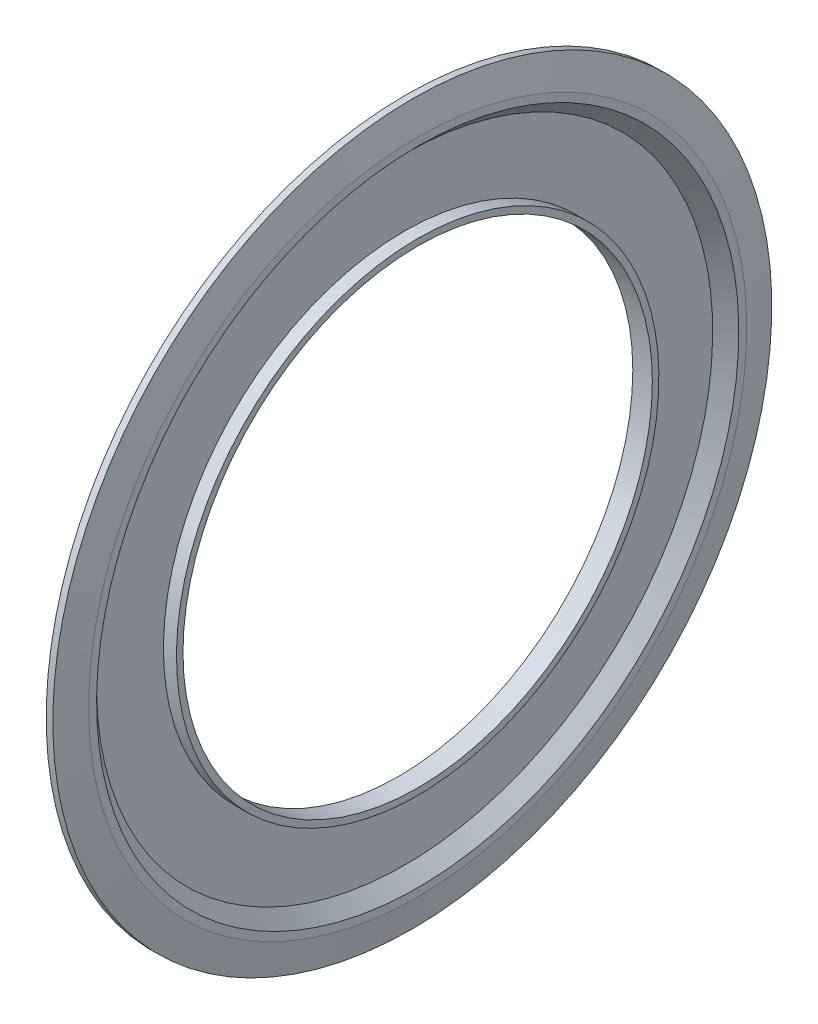
ISO-10303-21;
HEADER;
FILE_DESCRIPTION(('STEP AP214'),'2;1');
FILE_NAME('part.step','',(''),(''),'','','');
FILE_SCHEMA(('AUTOMOTIVE_DESIGN { 1 0 10303 214 1 1 1 1 }'));
ENDSEC;
DATA;
#1=APPLICATION_CONTEXT('core data for automotive mechanical design processes');
#2=APPLICATION_PROTOCOL_DEFINITION('international standard','automotive_design',2000,#1);
#3=PRODUCT_CONTEXT('',#1,'mechanical');
#4=PRODUCT('Part','Part','',(#3));
#5=PRODUCT_RELATED_PRODUCT_CATEGORY('part','',(#4));
#6=PRODUCT_DEFINITION_FORMATION('','',#4);
#7=PRODUCT_DEFINITION_CONTEXT('part definition',#1,'design');
#8=PRODUCT_DEFINITION('design','',#6,#7);
#9=PRODUCT_DEFINITION_SHAPE('','',#8);
#10=(LENGTH_UNIT() NAMED_UNIT(*) SI_UNIT(.MILLI.,.METRE.));
#11=(NAMED_UNIT(*) PLANE_ANGLE_UNIT() SI_UNIT($,.RADIAN.));
#12=(NAMED_UNIT(*) SI_UNIT($,.STERADIAN.) SOLID_ANGLE_UNIT());
#13=UNCERTAINTY_MEASURE_WITH_UNIT(LENGTH_MEASURE(1.E-05),#10,'distance_accuracy_value','');
#14=(GEOMETRIC_REPRESENTATION_CONTEXT(3) GLOBAL_UNCERTAINTY_ASSIGNED_CONTEXT((#13)) GLOBAL_UNIT_ASSIGNED_CONTEXT((#10,
#11,#12)) REPRESENTATION_CONTEXT('',''));
#15=CARTESIAN_POINT('',(0.,0.,0.));
#16=DIRECTION('',(0.,0.,1.));
#17=DIRECTION('',(1.,0.,0.));
#18=AXIS2_PLACEMENT_3D('',#15,#16,#17);
#19=CARTESIAN_POINT('',(0.821553724366853,10.472,0.));
#20=DIRECTION('',(1.,0.,0.));
#21=DIRECTION('',(0.,-1.,0.));
#22=AXIS2_PLACEMENT_3D('',#19,#20,#21);
#23=PLANE('',#22);
#24=CARTESIAN_POINT('',(0.821553724366853,0.,0.));
#25=DIRECTION('',(-1.,0.,0.));
#26=DIRECTION('',(0.,1.,0.));
#27=AXIS2_PLACEMENT_3D('',#24,#25,#26);
#28=CIRCLE('',#27,10.344);
#29=CARTESIAN_POINT('',(0.821553724366853,10.344,0.));
#30=VERTEX_POINT('',#29);
#31=EDGE_CURVE('E11',#30,#30,#28,.T.);
#32=ORIENTED_EDGE('',*,*,#31,.T.);
#33=EDGE_LOOP('',(#32));
#34=FACE_BOUND('',#33,.T.);
#35=CARTESIAN_POINT('',(0.821553724366853,0.,0.));
#36=DIRECTION('',(-1.,0.,0.));
#37=DIRECTION('',(0.,1.,0.));
#38=AXIS2_PLACEMENT_3D('',#35,#36,#37);
#39=CIRCLE('',#38,10.6);
#40=CARTESIAN_POINT('',(0.821553724366853,10.6,0.));
#41=VERTEX_POINT('',#40);
#42=EDGE_CURVE('E56',#41,#41,#39,.T.);
#43=ORIENTED_EDGE('',*,*,#42,.F.);
#44=EDGE_LOOP('',(#43));
#45=FACE_BOUND('',#44,.T.);
#46=ADVANCED_FACE('F16',(#34,#45),#23,.T.);
#47=CARTESIAN_POINT('',(0.611553724366853,0.,0.));
#48=DIRECTION('',(1.,0.,0.));
#49=DIRECTION('',(0.,1.,0.));
#50=AXIS2_PLACEMENT_3D('',#47,#48,#49);
#51=CONICAL_SURFACE('',#50,10.134,0.785398163397448);
#52=CARTESIAN_POINT('',(0.401553724366852,0.,0.));
#53=DIRECTION('',(-1.,0.,0.));
#54=DIRECTION('',(0.,1.,0.));
#55=AXIS2_PLACEMENT_3D('',#52,#53,#54);
#56=CIRCLE('',#55,9.924);
#57=CARTESIAN_POINT('',(0.401553724366852,9.924,0.));
#58=VERTEX_POINT('',#57);
#59=EDGE_CURVE('E26',#58,#58,#56,.T.);
#60=ORIENTED_EDGE('',*,*,#59,.T.);
#61=EDGE_LOOP('',(#60));
#62=FACE_BOUND('',#61,.T.);
#63=ORIENTED_EDGE('',*,*,#31,.F.);
#64=EDGE_LOOP('',(#63));
#65=FACE_BOUND('',#64,.T.);
#66=ADVANCED_FACE('F113',(#62,#65),#51,.F.);
#67=CARTESIAN_POINT('',(0.401553724366851,8.847,0.));
#68=DIRECTION('',(1.,0.,0.));
#69=DIRECTION('',(0.,-1.,0.));
#70=AXIS2_PLACEMENT_3D('',#67,#68,#69);
#71=PLANE('',#70);
#72=CARTESIAN_POINT('',(0.401553724366851,0.,0.));
#73=DIRECTION('',(-1.,0.,0.));
#74=DIRECTION('',(0.,1.,0.));
#75=AXIS2_PLACEMENT_3D('',#72,#73,#74);
#76=CIRCLE('',#75,7.77);
#77=CARTESIAN_POINT('',(0.401553724366851,7.77,0.));
#78=VERTEX_POINT('',#77);
#79=EDGE_CURVE('E20',#78,#78,#76,.T.);
#80=ORIENTED_EDGE('',*,*,#79,.T.);
#81=EDGE_LOOP('',(#80));
#82=FACE_BOUND('',#81,.T.);
#83=ORIENTED_EDGE('',*,*,#59,.F.);
#84=EDGE_LOOP('',(#83));
#85=FACE_BOUND('',#84,.T.);
#86=ADVANCED_FACE('F68',(#82,#85),#71,.T.);
#87=CARTESIAN_POINT('',(0.611553724366853,0.,0.));
#88=DIRECTION('',(1.,0.,0.));
#89=DIRECTION('',(0.,1.,0.));
#90=AXIS2_PLACEMENT_3D('',#87,#88,#89);
#91=CYLINDRICAL_SURFACE('',#90,7.77);
#92=CARTESIAN_POINT('',(0.821553724366853,0.,0.));
#93=DIRECTION('',(-1.,0.,0.));
#94=DIRECTION('',(0.,1.,0.));
#95=AXIS2_PLACEMENT_3D('',#92,#93,#94);
#96=CIRCLE('',#95,7.77);
#97=CARTESIAN_POINT('',(0.821553724366853,7.77,0.));
#98=VERTEX_POINT('',#97);
#99=EDGE_CURVE('E71',#98,#98,#96,.T.);
#100=ORIENTED_EDGE('',*,*,#99,.T.);
#101=EDGE_LOOP('',(#100));
#102=FACE_BOUND('',#101,.T.);
#103=ORIENTED_EDGE('',*,*,#79,.F.);
#104=EDGE_LOOP('',(#103));
#105=FACE_BOUND('',#104,.T.);
#106=ADVANCED_FACE('F123',(#102,#105),#91,.T.);
#107=CARTESIAN_POINT('',(0.821553724366853,7.665,0.));
#108=DIRECTION('',(1.,0.,0.));
#109=DIRECTION('',(0.,-1.,0.));
#110=AXIS2_PLACEMENT_3D('',#107,#108,#109);
#111=PLANE('',#110);
#112=CARTESIAN_POINT('',(0.821553724366853,0.,0.));
#113=DIRECTION('',(-1.,0.,0.));
#114=DIRECTION('',(0.,1.,0.));
#115=AXIS2_PLACEMENT_3D('',#112,#113,#114);
#116=CIRCLE('',#115,7.56);
#117=CARTESIAN_POINT('',(0.821553724366853,7.56,0.));
#118=VERTEX_POINT('',#117);
#119=EDGE_CURVE('E73',#118,#118,#116,.T.);
#120=ORIENTED_EDGE('',*,*,#119,.T.);
#121=EDGE_LOOP('',(#120));
#122=FACE_BOUND('',#121,.T.);
#123=ORIENTED_EDGE('',*,*,#99,.F.);
#124=EDGE_LOOP('',(#123));
#125=FACE_BOUND('',#124,.T.);
#126=ADVANCED_FACE('F144',(#122,#125),#111,.T.);
#127=CARTESIAN_POINT('',(0.506553724366852,0.,0.));
#128=DIRECTION('',(1.,0.,0.));
#129=DIRECTION('',(0.,1.,0.));
#130=AXIS2_PLACEMENT_3D('',#127,#128,#129);
#131=CYLINDRICAL_SURFACE('',#130,7.56);
#132=CARTESIAN_POINT('',(0.191553724366852,0.,0.));
#133=DIRECTION('',(-1.,0.,0.));
#134=DIRECTION('',(0.,1.,0.));
#135=AXIS2_PLACEMENT_3D('',#132,#133,#134);
#136=CIRCLE('',#135,7.56);
#137=CARTESIAN_POINT('',(0.191553724366852,7.56,0.));
#138=VERTEX_POINT('',#137);
#139=EDGE_CURVE('E78',#138,#138,#136,.T.);
#140=ORIENTED_EDGE('',*,*,#139,.T.);
#141=EDGE_LOOP('',(#140));
#142=FACE_BOUND('',#141,.T.);
#143=ORIENTED_EDGE('',*,*,#119,.F.);
#144=EDGE_LOOP('',(#143));
#145=FACE_BOUND('',#144,.T.);
#146=ADVANCED_FACE('F138',(#142,#145),#131,.F.);
#147=CARTESIAN_POINT('',(0.191553724366852,8.78549242404918,0.));
#148=DIRECTION('',(-1.,0.,0.));
#149=DIRECTION('',(0.,1.,0.));
#150=AXIS2_PLACEMENT_3D('',#147,#148,#149);
#151=PLANE('',#150);
#152=CARTESIAN_POINT('',(0.191553724366852,0.,0.));
#153=DIRECTION('',(-1.,0.,0.));
#154=DIRECTION('',(0.,1.,0.));
#155=AXIS2_PLACEMENT_3D('',#152,#153,#154);
#156=CIRCLE('',#155,10.0109848480983);
#157=CARTESIAN_POINT('',(0.191553724366852,10.0109848480983,0.));
#158=VERTEX_POINT('',#157);
#159=EDGE_CURVE('E81',#158,#158,#156,.T.);
#160=ORIENTED_EDGE('',*,*,#159,.T.);
#161=EDGE_LOOP('',(#160));
#162=FACE_BOUND('',#161,.T.);
#163=ORIENTED_EDGE('',*,*,#139,.F.);
#164=EDGE_LOOP('',(#163));
#165=FACE_BOUND('',#164,.T.);
#166=ADVANCED_FACE('F131',(#162,#165),#151,.T.);
#167=CARTESIAN_POINT('',(0.401553724366851,0.,0.));
#168=DIRECTION('',(1.,0.,0.));
#169=DIRECTION('',(0.,1.,0.));
#170=AXIS2_PLACEMENT_3D('',#167,#168,#169);
#171=CONICAL_SURFACE('',#170,10.2209848480983,0.785398163397448);
#172=CARTESIAN_POINT('',(0.611553724366852,0.,0.));
#173=DIRECTION('',(-1.,0.,0.));
#174=DIRECTION('',(0.,1.,0.));
#175=AXIS2_PLACEMENT_3D('',#172,#173,#174);
#176=CIRCLE('',#175,10.4309848480983);
#177=CARTESIAN_POINT('',(0.611553724366852,10.4309848480983,0.));
#178=VERTEX_POINT('',#177);
#179=EDGE_CURVE('E85',#178,#178,#176,.T.);
#180=ORIENTED_EDGE('',*,*,#179,.T.);
#181=EDGE_LOOP('',(#180));
#182=FACE_BOUND('',#181,.T.);
#183=ORIENTED_EDGE('',*,*,#159,.F.);
#184=EDGE_LOOP('',(#183));
#185=FACE_BOUND('',#184,.T.);
#186=ADVANCED_FACE('F18',(#182,#185),#171,.T.);
#187=CARTESIAN_POINT('',(0.611553724366853,10.5063061143789,0.));
#188=DIRECTION('',(-1.,0.,0.));
#189=DIRECTION('',(0.,1.,0.));
#190=AXIS2_PLACEMENT_3D('',#187,#188,#189);
#191=PLANE('',#190);
#192=CARTESIAN_POINT('',(0.611553724366853,0.,0.));
#193=DIRECTION('',(-1.,0.,0.));
#194=DIRECTION('',(0.,1.,0.));
#195=AXIS2_PLACEMENT_3D('',#192,#193,#194);
#196=CIRCLE('',#195,10.5816273806596);
#197=CARTESIAN_POINT('',(0.611553724366853,10.5816273806596,0.));
#198=VERTEX_POINT('',#197);
#199=EDGE_CURVE('E88',#198,#198,#196,.T.);
#200=ORIENTED_EDGE('',*,*,#199,.T.);
#201=EDGE_LOOP('',(#200));
#202=FACE_BOUND('',#201,.T.);
#203=ORIENTED_EDGE('',*,*,#179,.F.);
#204=EDGE_LOOP('',(#203));
#205=FACE_BOUND('',#204,.T.);
#206=ADVANCED_FACE('F125',(#202,#205),#191,.T.);
#207=CARTESIAN_POINT('',(0.523533709571701,0.,0.));
#208=DIRECTION('',(-1.,0.,0.));
#209=DIRECTION('',(0.,1.,0.));
#210=AXIS2_PLACEMENT_3D('',#207,#208,#209);
#211=CONICAL_SURFACE('',#210,11.0808136903298,1.39626340159546);
#212=CARTESIAN_POINT('',(0.435513694776549,0.,0.));
#213=DIRECTION('',(-1.,0.,0.));
#214=DIRECTION('',(0.,1.,0.));
#215=AXIS2_PLACEMENT_3D('',#212,#213,#214);
#216=CIRCLE('',#215,11.58);
#217=CARTESIAN_POINT('',(0.435513694776549,11.58,0.));
#218=VERTEX_POINT('',#217);
#219=EDGE_CURVE('E49',#218,#218,#216,.T.);
#220=ORIENTED_EDGE('',*,*,#219,.T.);
#221=EDGE_LOOP('',(#220));
#222=FACE_BOUND('',#221,.T.);
#223=ORIENTED_EDGE('',*,*,#199,.F.);
#224=EDGE_LOOP('',(#223));
#225=FACE_BOUND('',#224,.T.);
#226=ADVANCED_FACE('F108',(#222,#225),#211,.F.);
#227=CARTESIAN_POINT('',(0.542133489024553,0.,0.));
#228=DIRECTION('',(1.,0.,0.));
#229=DIRECTION('',(0.,1.,0.));
#230=AXIS2_PLACEMENT_3D('',#227,#228,#229);
#231=CYLINDRICAL_SURFACE('',#230,11.58);
#232=CARTESIAN_POINT('',(0.648753283272557,0.,0.));
#233=DIRECTION('',(-1.,0.,0.));
#234=DIRECTION('',(0.,1.,0.));
#235=AXIS2_PLACEMENT_3D('',#232,#233,#234);
#236=CIRCLE('',#235,11.58);
#237=CARTESIAN_POINT('',(0.648753283272557,11.58,0.));
#238=VERTEX_POINT('',#237);
#239=EDGE_CURVE('E95',#238,#238,#236,.T.);
#240=ORIENTED_EDGE('',*,*,#239,.T.);
#241=EDGE_LOOP('',(#240));
#242=FACE_BOUND('',#241,.T.);
#243=ORIENTED_EDGE('',*,*,#219,.F.);
#244=EDGE_LOOP('',(#243));
#245=FACE_BOUND('',#244,.T.);
#246=ADVANCED_FACE('F98',(#242,#245),#231,.T.);
#247=CARTESIAN_POINT('',(0.735153503819705,0.,0.));
#248=DIRECTION('',(-1.,0.,0.));
#249=DIRECTION('',(0.,1.,0.));
#250=AXIS2_PLACEMENT_3D('',#247,#248,#249);
#251=CONICAL_SURFACE('',#250,11.09,1.39626340159546);
#252=ORIENTED_EDGE('',*,*,#42,.T.);
#253=EDGE_LOOP('',(#252));
#254=FACE_BOUND('',#253,.T.);
#255=ORIENTED_EDGE('',*,*,#239,.F.);
#256=EDGE_LOOP('',(#255));
#257=FACE_BOUND('',#256,.T.);
#258=ADVANCED_FACE('F101',(#254,#257),#251,.T.);
#259=CLOSED_SHELL('',(#46,#66,#86,#106,#126,#146,#166,#186,#206,#226,#246,#258));
#260=MANIFOLD_SOLID_BREP('B1',#259);
#261=ADVANCED_BREP_SHAPE_REPRESENTATION('',(#18,#260),#14);
#262=SHAPE_DEFINITION_REPRESENTATION(#9,#261);
ENDSEC;
END-ISO-10303-21;
